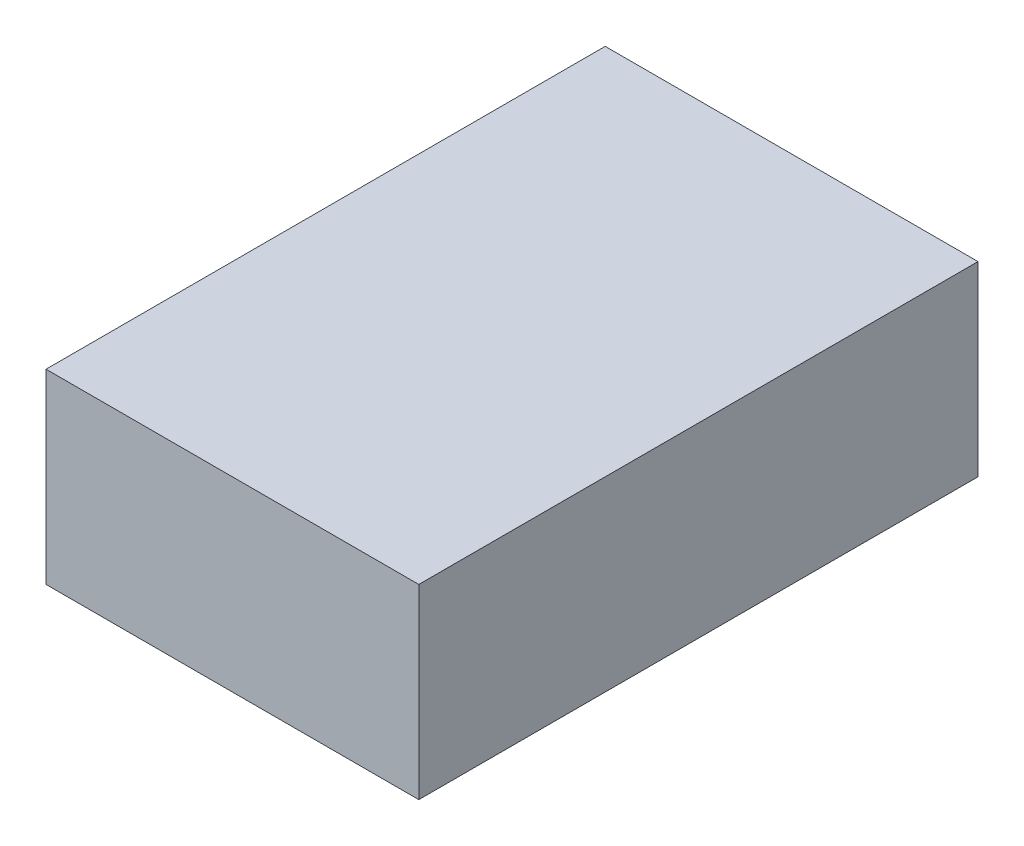
ISO-10303-21;
HEADER;
FILE_DESCRIPTION(('STEP AP214'),'2;1');
FILE_NAME('part.step','',(''),(''),'','','');
FILE_SCHEMA(('AUTOMOTIVE_DESIGN { 1 0 10303 214 1 1 1 1 }'));
ENDSEC;
DATA;
#1=APPLICATION_CONTEXT('core data for automotive mechanical design processes');
#2=APPLICATION_PROTOCOL_DEFINITION('international standard','automotive_design',2000,#1);
#3=PRODUCT_CONTEXT('',#1,'mechanical');
#4=PRODUCT('Part','Part','',(#3));
#5=PRODUCT_RELATED_PRODUCT_CATEGORY('part','',(#4));
#6=PRODUCT_DEFINITION_FORMATION('','',#4);
#7=PRODUCT_DEFINITION_CONTEXT('part definition',#1,'design');
#8=PRODUCT_DEFINITION('design','',#6,#7);
#9=PRODUCT_DEFINITION_SHAPE('','',#8);
#10=(LENGTH_UNIT() NAMED_UNIT(*) SI_UNIT(.MILLI.,.METRE.));
#11=(NAMED_UNIT(*) PLANE_ANGLE_UNIT() SI_UNIT($,.RADIAN.));
#12=(NAMED_UNIT(*) SI_UNIT($,.STERADIAN.) SOLID_ANGLE_UNIT());
#13=UNCERTAINTY_MEASURE_WITH_UNIT(LENGTH_MEASURE(1.E-05),#10,'distance_accuracy_value','');
#14=(GEOMETRIC_REPRESENTATION_CONTEXT(3) GLOBAL_UNCERTAINTY_ASSIGNED_CONTEXT((#13)) GLOBAL_UNIT_ASSIGNED_CONTEXT((#10,
#11,#12)) REPRESENTATION_CONTEXT('',''));
#15=CARTESIAN_POINT('',(0.,0.,0.));
#16=DIRECTION('',(0.,0.,1.));
#17=DIRECTION('',(1.,0.,0.));
#18=AXIS2_PLACEMENT_3D('',#15,#16,#17);
#19=CARTESIAN_POINT('',(2.,-1.,6.));
#20=DIRECTION('',(-1.,0.,0.));
#21=DIRECTION('',(0.,0.,1.));
#22=AXIS2_PLACEMENT_3D('',#19,#20,#21);
#23=PLANE('',#22);
#24=DIRECTION('',(0.,1.,0.));
#25=VECTOR('',#24,1.);
#26=CARTESIAN_POINT('',(2.,-1.,0.));
#27=LINE('',#26,#25);
#28=CARTESIAN_POINT('',(2.,-1.,0.));
#29=VERTEX_POINT('',#28);
#30=CARTESIAN_POINT('',(2.,1.,0.));
#31=VERTEX_POINT('',#30);
#32=EDGE_CURVE('E107',#29,#31,#27,.T.);
#33=ORIENTED_EDGE('',*,*,#32,.T.);
#34=DIRECTION('',(0.,0.,-1.));
#35=VECTOR('',#34,1.);
#36=CARTESIAN_POINT('',(2.,1.,6.));
#37=LINE('',#36,#35);
#38=CARTESIAN_POINT('',(2.,1.,6.));
#39=VERTEX_POINT('',#38);
#40=EDGE_CURVE('E11',#39,#31,#37,.T.);
#41=ORIENTED_EDGE('',*,*,#40,.F.);
#42=DIRECTION('',(0.,1.,0.));
#43=VECTOR('',#42,1.);
#44=CARTESIAN_POINT('',(2.,-1.,6.));
#45=LINE('',#44,#43);
#46=CARTESIAN_POINT('',(2.,-1.,6.));
#47=VERTEX_POINT('',#46);
#48=EDGE_CURVE('E91',#47,#39,#45,.T.);
#49=ORIENTED_EDGE('',*,*,#48,.F.);
#50=DIRECTION('',(0.,0.,-1.));
#51=VECTOR('',#50,1.);
#52=CARTESIAN_POINT('',(2.,-1.,6.));
#53=LINE('',#52,#51);
#54=EDGE_CURVE('E103',#47,#29,#53,.T.);
#55=ORIENTED_EDGE('',*,*,#54,.T.);
#56=EDGE_LOOP('',(#33,#41,#49,#55));
#57=FACE_BOUND('',#56,.T.);
#58=ADVANCED_FACE('F39',(#57),#23,.F.);
#59=CARTESIAN_POINT('',(-2.,1.,6.));
#60=DIRECTION('',(0.,-1.,0.));
#61=DIRECTION('',(0.,0.,-1.));
#62=AXIS2_PLACEMENT_3D('',#59,#60,#61);
#63=PLANE('',#62);
#64=DIRECTION('',(-1.,0.,0.));
#65=VECTOR('',#64,1.);
#66=CARTESIAN_POINT('',(-2.,1.,0.));
#67=LINE('',#66,#65);
#68=CARTESIAN_POINT('',(-2.,1.,0.));
#69=VERTEX_POINT('',#68);
#70=EDGE_CURVE('E96',#31,#69,#67,.T.);
#71=ORIENTED_EDGE('',*,*,#70,.T.);
#72=DIRECTION('',(0.,0.,-1.));
#73=VECTOR('',#72,1.);
#74=CARTESIAN_POINT('',(-2.,1.,6.));
#75=LINE('',#74,#73);
#76=CARTESIAN_POINT('',(-2.,1.,6.));
#77=VERTEX_POINT('',#76);
#78=EDGE_CURVE('E48',#77,#69,#75,.T.);
#79=ORIENTED_EDGE('',*,*,#78,.F.);
#80=DIRECTION('',(-1.,0.,0.));
#81=VECTOR('',#80,1.);
#82=CARTESIAN_POINT('',(-2.,1.,6.));
#83=LINE('',#82,#81);
#84=EDGE_CURVE('E86',#39,#77,#83,.T.);
#85=ORIENTED_EDGE('',*,*,#84,.F.);
#86=ORIENTED_EDGE('',*,*,#40,.T.);
#87=EDGE_LOOP('',(#71,#79,#85,#86));
#88=FACE_BOUND('',#87,.T.);
#89=ADVANCED_FACE('F95',(#88),#63,.F.);
#90=CARTESIAN_POINT('',(-2.,-1.,6.));
#91=DIRECTION('',(1.,0.,0.));
#92=DIRECTION('',(0.,0.,-1.));
#93=AXIS2_PLACEMENT_3D('',#90,#91,#92);
#94=PLANE('',#93);
#95=DIRECTION('',(0.,-1.,0.));
#96=VECTOR('',#95,1.);
#97=CARTESIAN_POINT('',(-2.,-1.,0.));
#98=LINE('',#97,#96);
#99=CARTESIAN_POINT('',(-2.,-1.,0.));
#100=VERTEX_POINT('',#99);
#101=EDGE_CURVE('E73',#69,#100,#98,.T.);
#102=ORIENTED_EDGE('',*,*,#101,.T.);
#103=DIRECTION('',(0.,0.,-1.));
#104=VECTOR('',#103,1.);
#105=CARTESIAN_POINT('',(-2.,-1.,6.));
#106=LINE('',#105,#104);
#107=CARTESIAN_POINT('',(-2.,-1.,6.));
#108=VERTEX_POINT('',#107);
#109=EDGE_CURVE('E98',#108,#100,#106,.T.);
#110=ORIENTED_EDGE('',*,*,#109,.F.);
#111=DIRECTION('',(0.,-1.,0.));
#112=VECTOR('',#111,1.);
#113=CARTESIAN_POINT('',(-2.,-1.,6.));
#114=LINE('',#113,#112);
#115=EDGE_CURVE('E89',#77,#108,#114,.T.);
#116=ORIENTED_EDGE('',*,*,#115,.F.);
#117=ORIENTED_EDGE('',*,*,#78,.T.);
#118=EDGE_LOOP('',(#102,#110,#116,#117));
#119=FACE_BOUND('',#118,.T.);
#120=ADVANCED_FACE('F99',(#119),#94,.F.);
#121=CARTESIAN_POINT('',(-2.,-1.,6.));
#122=DIRECTION('',(0.,1.,0.));
#123=DIRECTION('',(0.,0.,1.));
#124=AXIS2_PLACEMENT_3D('',#121,#122,#123);
#125=PLANE('',#124);
#126=DIRECTION('',(1.,0.,0.));
#127=VECTOR('',#126,1.);
#128=CARTESIAN_POINT('',(-2.,-1.,0.));
#129=LINE('',#128,#127);
#130=EDGE_CURVE('E79',#100,#29,#129,.T.);
#131=ORIENTED_EDGE('',*,*,#130,.T.);
#132=ORIENTED_EDGE('',*,*,#54,.F.);
#133=DIRECTION('',(1.,0.,0.));
#134=VECTOR('',#133,1.);
#135=CARTESIAN_POINT('',(-2.,-1.,6.));
#136=LINE('',#135,#134);
#137=EDGE_CURVE('E56',#108,#47,#136,.T.);
#138=ORIENTED_EDGE('',*,*,#137,.F.);
#139=ORIENTED_EDGE('',*,*,#109,.T.);
#140=EDGE_LOOP('',(#131,#132,#138,#139));
#141=FACE_BOUND('',#140,.T.);
#142=ADVANCED_FACE('F120',(#141),#125,.F.);
#143=CARTESIAN_POINT('',(0.,0.,6.));
#144=DIRECTION('',(0.,0.,-1.));
#145=DIRECTION('',(-1.,0.,0.));
#146=AXIS2_PLACEMENT_3D('',#143,#144,#145);
#147=PLANE('',#146);
#148=ORIENTED_EDGE('',*,*,#48,.T.);
#149=ORIENTED_EDGE('',*,*,#84,.T.);
#150=ORIENTED_EDGE('',*,*,#115,.T.);
#151=ORIENTED_EDGE('',*,*,#137,.T.);
#152=EDGE_LOOP('',(#148,#149,#150,#151));
#153=FACE_BOUND('',#152,.T.);
#154=ADVANCED_FACE('F87',(#153),#147,.F.);
#155=CARTESIAN_POINT('',(0.,0.,0.));
#156=DIRECTION('',(0.,0.,-1.));
#157=DIRECTION('',(-1.,0.,0.));
#158=AXIS2_PLACEMENT_3D('',#155,#156,#157);
#159=PLANE('',#158);
#160=ORIENTED_EDGE('',*,*,#32,.F.);
#161=ORIENTED_EDGE('',*,*,#130,.F.);
#162=ORIENTED_EDGE('',*,*,#101,.F.);
#163=ORIENTED_EDGE('',*,*,#70,.F.);
#164=EDGE_LOOP('',(#160,#161,#162,#163));
#165=FACE_BOUND('',#164,.T.);
#166=ADVANCED_FACE('F123',(#165),#159,.T.);
#167=CLOSED_SHELL('',(#58,#89,#120,#142,#154,#166));
#168=MANIFOLD_SOLID_BREP('B2',#167);
#169=ADVANCED_BREP_SHAPE_REPRESENTATION('',(#18,#168),#14);
#170=SHAPE_DEFINITION_REPRESENTATION(#9,#169);
ENDSEC;
END-ISO-10303-21;
